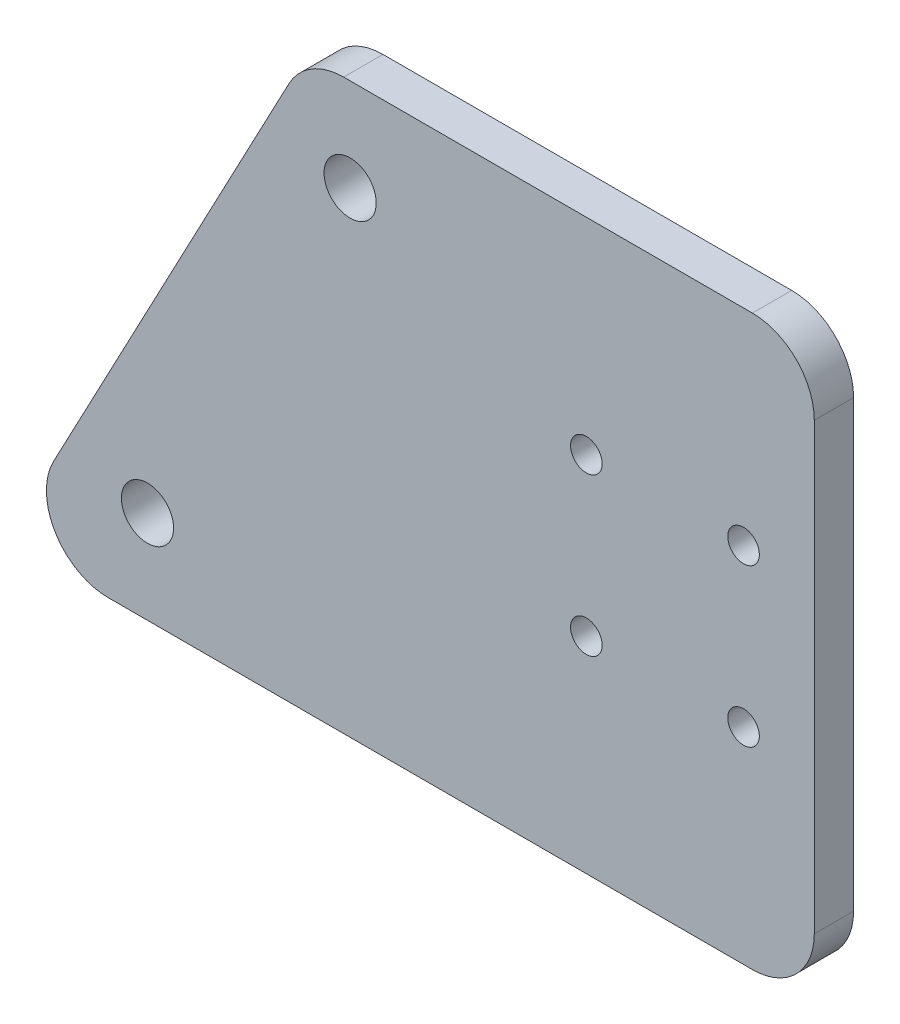
ISO-10303-21;
HEADER;
FILE_DESCRIPTION(('STEP AP214'),'2;1');
FILE_NAME('part.step','',(''),(''),'','','');
FILE_SCHEMA(('AUTOMOTIVE_DESIGN { 1 0 10303 214 1 1 1 1 }'));
ENDSEC;
DATA;
#1=APPLICATION_CONTEXT('core data for automotive mechanical design processes');
#2=APPLICATION_PROTOCOL_DEFINITION('international standard','automotive_design',2000,#1);
#3=PRODUCT_CONTEXT('',#1,'mechanical');
#4=PRODUCT('Part','Part','',(#3));
#5=PRODUCT_RELATED_PRODUCT_CATEGORY('part','',(#4));
#6=PRODUCT_DEFINITION_FORMATION('','',#4);
#7=PRODUCT_DEFINITION_CONTEXT('part definition',#1,'design');
#8=PRODUCT_DEFINITION('design','',#6,#7);
#9=PRODUCT_DEFINITION_SHAPE('','',#8);
#10=(LENGTH_UNIT() NAMED_UNIT(*) SI_UNIT(.MILLI.,.METRE.));
#11=(NAMED_UNIT(*) PLANE_ANGLE_UNIT() SI_UNIT($,.RADIAN.));
#12=(NAMED_UNIT(*) SI_UNIT($,.STERADIAN.) SOLID_ANGLE_UNIT());
#13=UNCERTAINTY_MEASURE_WITH_UNIT(LENGTH_MEASURE(1.E-05),#10,'distance_accuracy_value','');
#14=(GEOMETRIC_REPRESENTATION_CONTEXT(3) GLOBAL_UNCERTAINTY_ASSIGNED_CONTEXT((#13)) GLOBAL_UNIT_ASSIGNED_CONTEXT((#10,
#11,#12)) REPRESENTATION_CONTEXT('',''));
#15=CARTESIAN_POINT('',(0.,0.,0.));
#16=DIRECTION('',(0.,0.,1.));
#17=DIRECTION('',(1.,0.,0.));
#18=AXIS2_PLACEMENT_3D('',#15,#16,#17);
#19=CARTESIAN_POINT('',(0.,0.,6.35));
#20=DIRECTION('',(0.,0.,-1.));
#21=DIRECTION('',(-1.,0.,0.));
#22=AXIS2_PLACEMENT_3D('',#19,#20,#21);
#23=PLANE('',#22);
#24=CARTESIAN_POINT('',(338.57,-193.634865079161,6.35));
#25=DIRECTION('',(0.,0.,1.));
#26=DIRECTION('',(1.,0.,0.));
#27=AXIS2_PLACEMENT_3D('',#24,#25,#26);
#28=CIRCLE('',#27,2.55270000000004);
#29=CARTESIAN_POINT('',(341.1227,-193.634865079161,6.35));
#30=VERTEX_POINT('',#29);
#31=EDGE_CURVE('E392',#30,#30,#28,.T.);
#32=ORIENTED_EDGE('',*,*,#31,.F.);
#33=EDGE_LOOP('',(#32));
#34=FACE_BOUND('',#33,.T.);
#35=CARTESIAN_POINT('',(313.17,-193.634865079161,6.35));
#36=DIRECTION('',(0.,0.,1.));
#37=DIRECTION('',(1.,0.,0.));
#38=AXIS2_PLACEMENT_3D('',#35,#36,#37);
#39=CIRCLE('',#38,2.55270000000004);
#40=CARTESIAN_POINT('',(315.7227,-193.634865079161,6.35));
#41=VERTEX_POINT('',#40);
#42=EDGE_CURVE('E383',#41,#41,#39,.T.);
#43=ORIENTED_EDGE('',*,*,#42,.F.);
#44=EDGE_LOOP('',(#43));
#45=FACE_BOUND('',#44,.T.);
#46=CARTESIAN_POINT('',(313.17,-168.234865079161,6.35));
#47=DIRECTION('',(0.,0.,1.));
#48=DIRECTION('',(1.,0.,0.));
#49=AXIS2_PLACEMENT_3D('',#46,#47,#48);
#50=CIRCLE('',#49,2.55270000000004);
#51=CARTESIAN_POINT('',(315.7227,-168.234865079161,6.35));
#52=VERTEX_POINT('',#51);
#53=EDGE_CURVE('E378',#52,#52,#50,.T.);
#54=ORIENTED_EDGE('',*,*,#53,.F.);
#55=EDGE_LOOP('',(#54));
#56=FACE_BOUND('',#55,.T.);
#57=CARTESIAN_POINT('',(338.57,-168.234865079161,6.35));
#58=DIRECTION('',(0.,0.,1.));
#59=DIRECTION('',(1.,0.,0.));
#60=AXIS2_PLACEMENT_3D('',#57,#58,#59);
#61=CIRCLE('',#60,2.55270000000004);
#62=CARTESIAN_POINT('',(341.1227,-168.234865079161,6.35));
#63=VERTEX_POINT('',#62);
#64=EDGE_CURVE('E200',#63,#63,#61,.T.);
#65=ORIENTED_EDGE('',*,*,#64,.F.);
#66=EDGE_LOOP('',(#65));
#67=FACE_BOUND('',#66,.T.);
#68=DIRECTION('',(-1.,0.,0.));
#69=VECTOR('',#68,1.);
#70=CARTESIAN_POINT('',(267.938493178217,-135.,6.35));
#71=LINE('',#70,#69);
#72=CARTESIAN_POINT('',(340.,-135.,6.35));
#73=VERTEX_POINT('',#72);
#74=CARTESIAN_POINT('',(273.960259317813,-135.,6.35));
#75=VERTEX_POINT('',#74);
#76=EDGE_CURVE('E139',#73,#75,#71,.T.);
#77=ORIENTED_EDGE('',*,*,#76,.T.);
#78=CARTESIAN_POINT('',(273.960259317813,-145.,6.35));
#79=DIRECTION('',(0.,0.,-1.));
#80=DIRECTION('',(-1.,0.,0.));
#81=AXIS2_PLACEMENT_3D('',#78,#79,#80);
#82=CIRCLE('',#81,10.);
#83=CARTESIAN_POINT('',(265.121726438053,-140.322357801905,6.35));
#84=VERTEX_POINT('',#83);
#85=EDGE_CURVE('E154',#75,#84,#82,.F.);
#86=ORIENTED_EDGE('',*,*,#85,.T.);
#87=DIRECTION('',(-0.46776421980946,-0.883853287976034,0.));
#88=VECTOR('',#87,1.);
#89=CARTESIAN_POINT('',(267.938493178217,-135.,6.35));
#90=LINE('',#89,#88);
#91=CARTESIAN_POINT('',(227.085902265913,-212.192087960228,6.35));
#92=VERTEX_POINT('',#91);
#93=EDGE_CURVE('E121',#84,#92,#90,.T.);
#94=ORIENTED_EDGE('',*,*,#93,.T.);
#95=CARTESIAN_POINT('',(235.924435145673,-216.869730158322,6.35));
#96=DIRECTION('',(0.,0.,-1.));
#97=DIRECTION('',(-1.,0.,0.));
#98=AXIS2_PLACEMENT_3D('',#95,#96,#97);
#99=CIRCLE('',#98,10.);
#100=CARTESIAN_POINT('',(235.924435145673,-226.869730158322,6.35));
#101=VERTEX_POINT('',#100);
#102=EDGE_CURVE('E152',#92,#101,#99,.F.);
#103=ORIENTED_EDGE('',*,*,#102,.T.);
#104=DIRECTION('',(1.,0.,0.));
#105=VECTOR('',#104,1.);
#106=CARTESIAN_POINT('',(350.,-226.869730158322,6.35));
#107=LINE('',#106,#105);
#108=CARTESIAN_POINT('',(340.,-226.869730158322,6.35));
#109=VERTEX_POINT('',#108);
#110=EDGE_CURVE('E165',#101,#109,#107,.T.);
#111=ORIENTED_EDGE('',*,*,#110,.T.);
#112=CARTESIAN_POINT('',(340.,-216.869730158322,6.35));
#113=DIRECTION('',(0.,0.,-1.));
#114=DIRECTION('',(-1.,0.,0.));
#115=AXIS2_PLACEMENT_3D('',#112,#113,#114);
#116=CIRCLE('',#115,10.);
#117=CARTESIAN_POINT('',(350.,-216.869730158322,6.35));
#118=VERTEX_POINT('',#117);
#119=EDGE_CURVE('E56',#109,#118,#116,.F.);
#120=ORIENTED_EDGE('',*,*,#119,.T.);
#121=DIRECTION('',(0.,1.,0.));
#122=VECTOR('',#121,1.);
#123=CARTESIAN_POINT('',(350.,-135.,6.35));
#124=LINE('',#123,#122);
#125=CARTESIAN_POINT('',(350.,-145.,6.35));
#126=VERTEX_POINT('',#125);
#127=EDGE_CURVE('E140',#118,#126,#124,.T.);
#128=ORIENTED_EDGE('',*,*,#127,.T.);
#129=CARTESIAN_POINT('',(340.,-145.,6.35));
#130=DIRECTION('',(0.,0.,-1.));
#131=DIRECTION('',(-1.,0.,0.));
#132=AXIS2_PLACEMENT_3D('',#129,#130,#131);
#133=CIRCLE('',#132,10.);
#134=EDGE_CURVE('E149',#126,#73,#133,.F.);
#135=ORIENTED_EDGE('',*,*,#134,.T.);
#136=EDGE_LOOP('',(#77,#86,#94,#103,#111,#120,#128,#135));
#137=FACE_BOUND('',#136,.T.);
#138=CARTESIAN_POINT('',(275.,-150.,6.35));
#139=DIRECTION('',(0.,0.,1.));
#140=DIRECTION('',(1.,0.,0.));
#141=AXIS2_PLACEMENT_3D('',#138,#139,#140);
#142=CIRCLE('',#141,4.21640000000003);
#143=CARTESIAN_POINT('',(279.2164,-150.,6.35));
#144=VERTEX_POINT('',#143);
#145=EDGE_CURVE('E134',#144,#144,#142,.T.);
#146=ORIENTED_EDGE('',*,*,#145,.F.);
#147=EDGE_LOOP('',(#146));
#148=FACE_BOUND('',#147,.T.);
#149=CARTESIAN_POINT('',(242.256504613338,-211.869730158322,6.35));
#150=DIRECTION('',(0.,0.,1.));
#151=DIRECTION('',(1.,0.,0.));
#152=AXIS2_PLACEMENT_3D('',#149,#150,#151);
#153=CIRCLE('',#152,4.21640000000001);
#154=CARTESIAN_POINT('',(246.472904613338,-211.869730158322,6.35));
#155=VERTEX_POINT('',#154);
#156=EDGE_CURVE('E190',#155,#155,#153,.T.);
#157=ORIENTED_EDGE('',*,*,#156,.F.);
#158=EDGE_LOOP('',(#157));
#159=FACE_BOUND('',#158,.T.);
#160=ADVANCED_FACE('F35',(#34,#45,#56,#67,#137,#148,#159),#23,.F.);
#161=CARTESIAN_POINT('',(0.,0.,0.));
#162=DIRECTION('',(0.,0.,-1.));
#163=DIRECTION('',(-1.,0.,0.));
#164=AXIS2_PLACEMENT_3D('',#161,#162,#163);
#165=PLANE('',#164);
#166=CARTESIAN_POINT('',(338.57,-193.634865079161,0.));
#167=DIRECTION('',(0.,0.,1.));
#168=DIRECTION('',(1.,0.,0.));
#169=AXIS2_PLACEMENT_3D('',#166,#167,#168);
#170=CIRCLE('',#169,2.55270000000004);
#171=CARTESIAN_POINT('',(341.1227,-193.634865079161,0.));
#172=VERTEX_POINT('',#171);
#173=EDGE_CURVE('E390',#172,#172,#170,.T.);
#174=ORIENTED_EDGE('',*,*,#173,.T.);
#175=EDGE_LOOP('',(#174));
#176=FACE_BOUND('',#175,.T.);
#177=CARTESIAN_POINT('',(313.17,-193.634865079161,0.));
#178=DIRECTION('',(0.,0.,1.));
#179=DIRECTION('',(1.,0.,0.));
#180=AXIS2_PLACEMENT_3D('',#177,#178,#179);
#181=CIRCLE('',#180,2.55270000000004);
#182=CARTESIAN_POINT('',(315.7227,-193.634865079161,0.));
#183=VERTEX_POINT('',#182);
#184=EDGE_CURVE('E380',#183,#183,#181,.T.);
#185=ORIENTED_EDGE('',*,*,#184,.T.);
#186=EDGE_LOOP('',(#185));
#187=FACE_BOUND('',#186,.T.);
#188=CARTESIAN_POINT('',(313.17,-168.234865079161,0.));
#189=DIRECTION('',(0.,0.,1.));
#190=DIRECTION('',(1.,0.,0.));
#191=AXIS2_PLACEMENT_3D('',#188,#189,#190);
#192=CIRCLE('',#191,2.55270000000004);
#193=CARTESIAN_POINT('',(315.7227,-168.234865079161,0.));
#194=VERTEX_POINT('',#193);
#195=EDGE_CURVE('E205',#194,#194,#192,.T.);
#196=ORIENTED_EDGE('',*,*,#195,.T.);
#197=EDGE_LOOP('',(#196));
#198=FACE_BOUND('',#197,.T.);
#199=CARTESIAN_POINT('',(338.57,-168.234865079161,0.));
#200=DIRECTION('',(0.,0.,1.));
#201=DIRECTION('',(1.,0.,0.));
#202=AXIS2_PLACEMENT_3D('',#199,#200,#201);
#203=CIRCLE('',#202,2.55270000000004);
#204=CARTESIAN_POINT('',(341.1227,-168.234865079161,0.));
#205=VERTEX_POINT('',#204);
#206=EDGE_CURVE('E204',#205,#205,#203,.T.);
#207=ORIENTED_EDGE('',*,*,#206,.T.);
#208=EDGE_LOOP('',(#207));
#209=FACE_BOUND('',#208,.T.);
#210=CARTESIAN_POINT('',(275.,-150.,0.));
#211=DIRECTION('',(0.,0.,1.));
#212=DIRECTION('',(1.,0.,0.));
#213=AXIS2_PLACEMENT_3D('',#210,#211,#212);
#214=CIRCLE('',#213,4.21640000000003);
#215=CARTESIAN_POINT('',(279.2164,-150.,0.));
#216=VERTEX_POINT('',#215);
#217=EDGE_CURVE('E186',#216,#216,#214,.T.);
#218=ORIENTED_EDGE('',*,*,#217,.T.);
#219=EDGE_LOOP('',(#218));
#220=FACE_BOUND('',#219,.T.);
#221=DIRECTION('',(-0.46776421980946,-0.883853287976034,0.));
#222=VECTOR('',#221,1.);
#223=CARTESIAN_POINT('',(267.938493178217,-135.,0.));
#224=LINE('',#223,#222);
#225=CARTESIAN_POINT('',(265.121726438053,-140.322357801905,0.));
#226=VERTEX_POINT('',#225);
#227=CARTESIAN_POINT('',(227.085902265913,-212.192087960228,0.));
#228=VERTEX_POINT('',#227);
#229=EDGE_CURVE('E118',#226,#228,#224,.T.);
#230=ORIENTED_EDGE('',*,*,#229,.F.);
#231=CARTESIAN_POINT('',(273.960259317813,-145.,0.));
#232=DIRECTION('',(0.,0.,-1.));
#233=DIRECTION('',(-1.,0.,0.));
#234=AXIS2_PLACEMENT_3D('',#231,#232,#233);
#235=CIRCLE('',#234,10.);
#236=CARTESIAN_POINT('',(273.960259317813,-135.,0.));
#237=VERTEX_POINT('',#236);
#238=EDGE_CURVE('E101',#226,#237,#235,.T.);
#239=ORIENTED_EDGE('',*,*,#238,.T.);
#240=DIRECTION('',(-1.,0.,0.));
#241=VECTOR('',#240,1.);
#242=CARTESIAN_POINT('',(267.938493178217,-135.,0.));
#243=LINE('',#242,#241);
#244=CARTESIAN_POINT('',(340.,-135.,0.));
#245=VERTEX_POINT('',#244);
#246=EDGE_CURVE('E129',#245,#237,#243,.T.);
#247=ORIENTED_EDGE('',*,*,#246,.F.);
#248=CARTESIAN_POINT('',(340.,-145.,0.));
#249=DIRECTION('',(0.,0.,-1.));
#250=DIRECTION('',(-1.,0.,0.));
#251=AXIS2_PLACEMENT_3D('',#248,#249,#250);
#252=CIRCLE('',#251,10.);
#253=CARTESIAN_POINT('',(350.,-145.,0.));
#254=VERTEX_POINT('',#253);
#255=EDGE_CURVE('E122',#245,#254,#252,.T.);
#256=ORIENTED_EDGE('',*,*,#255,.T.);
#257=DIRECTION('',(0.,1.,0.));
#258=VECTOR('',#257,1.);
#259=CARTESIAN_POINT('',(350.,-135.,0.));
#260=LINE('',#259,#258);
#261=CARTESIAN_POINT('',(350.,-216.869730158322,0.));
#262=VERTEX_POINT('',#261);
#263=EDGE_CURVE('E132',#262,#254,#260,.T.);
#264=ORIENTED_EDGE('',*,*,#263,.F.);
#265=CARTESIAN_POINT('',(340.,-216.869730158322,0.));
#266=DIRECTION('',(0.,0.,-1.));
#267=DIRECTION('',(-1.,0.,0.));
#268=AXIS2_PLACEMENT_3D('',#265,#266,#267);
#269=CIRCLE('',#268,10.);
#270=CARTESIAN_POINT('',(340.,-226.869730158322,0.));
#271=VERTEX_POINT('',#270);
#272=EDGE_CURVE('E143',#262,#271,#269,.T.);
#273=ORIENTED_EDGE('',*,*,#272,.T.);
#274=DIRECTION('',(1.,0.,0.));
#275=VECTOR('',#274,1.);
#276=CARTESIAN_POINT('',(350.,-226.869730158322,0.));
#277=LINE('',#276,#275);
#278=CARTESIAN_POINT('',(235.924435145673,-226.869730158322,0.));
#279=VERTEX_POINT('',#278);
#280=EDGE_CURVE('E128',#279,#271,#277,.T.);
#281=ORIENTED_EDGE('',*,*,#280,.F.);
#282=CARTESIAN_POINT('',(235.924435145673,-216.869730158322,0.));
#283=DIRECTION('',(0.,0.,-1.));
#284=DIRECTION('',(-1.,0.,0.));
#285=AXIS2_PLACEMENT_3D('',#282,#283,#284);
#286=CIRCLE('',#285,10.);
#287=EDGE_CURVE('E112',#279,#228,#286,.T.);
#288=ORIENTED_EDGE('',*,*,#287,.T.);
#289=EDGE_LOOP('',(#230,#239,#247,#256,#264,#273,#281,#288));
#290=FACE_BOUND('',#289,.T.);
#291=CARTESIAN_POINT('',(242.256504613338,-211.869730158322,0.));
#292=DIRECTION('',(0.,0.,1.));
#293=DIRECTION('',(1.,0.,0.));
#294=AXIS2_PLACEMENT_3D('',#291,#292,#293);
#295=CIRCLE('',#294,4.21640000000001);
#296=CARTESIAN_POINT('',(246.472904613338,-211.869730158322,0.));
#297=VERTEX_POINT('',#296);
#298=EDGE_CURVE('E187',#297,#297,#295,.T.);
#299=ORIENTED_EDGE('',*,*,#298,.T.);
#300=EDGE_LOOP('',(#299));
#301=FACE_BOUND('',#300,.T.);
#302=ADVANCED_FACE('F125',(#176,#187,#198,#209,#220,#290,#301),#165,.T.);
#303=CARTESIAN_POINT('',(267.938493178217,-135.,6.35));
#304=DIRECTION('',(0.,-1.,0.));
#305=DIRECTION('',(0.,0.,-1.));
#306=AXIS2_PLACEMENT_3D('',#303,#304,#305);
#307=PLANE('',#306);
#308=ORIENTED_EDGE('',*,*,#246,.T.);
#309=DIRECTION('',(0.,0.,-1.));
#310=VECTOR('',#309,1.);
#311=CARTESIAN_POINT('',(273.960259317813,-135.,6.35));
#312=LINE('',#311,#310);
#313=EDGE_CURVE('E106',#237,#75,#312,.F.);
#314=ORIENTED_EDGE('',*,*,#313,.T.);
#315=ORIENTED_EDGE('',*,*,#76,.F.);
#316=DIRECTION('',(0.,0.,-1.));
#317=VECTOR('',#316,1.);
#318=CARTESIAN_POINT('',(340.,-135.,6.35));
#319=LINE('',#318,#317);
#320=EDGE_CURVE('E111',#73,#245,#319,.T.);
#321=ORIENTED_EDGE('',*,*,#320,.T.);
#322=EDGE_LOOP('',(#308,#314,#315,#321));
#323=FACE_BOUND('',#322,.T.);
#324=ADVANCED_FACE('F240',(#323),#307,.F.);
#325=CARTESIAN_POINT('',(267.938493178217,-135.,6.35));
#326=DIRECTION('',(0.883853287976034,-0.46776421980946,0.));
#327=DIRECTION('',(0.46776421980946,0.883853287976034,0.));
#328=AXIS2_PLACEMENT_3D('',#325,#326,#327);
#329=PLANE('',#328);
#330=ORIENTED_EDGE('',*,*,#93,.F.);
#331=DIRECTION('',(0.,0.,-1.));
#332=VECTOR('',#331,1.);
#333=CARTESIAN_POINT('',(265.121726438053,-140.322357801905,6.35));
#334=LINE('',#333,#332);
#335=EDGE_CURVE('E105',#84,#226,#334,.T.);
#336=ORIENTED_EDGE('',*,*,#335,.T.);
#337=ORIENTED_EDGE('',*,*,#229,.T.);
#338=DIRECTION('',(0.,0.,-1.));
#339=VECTOR('',#338,1.);
#340=CARTESIAN_POINT('',(227.085902265913,-212.192087960228,6.35));
#341=LINE('',#340,#339);
#342=EDGE_CURVE('E123',#228,#92,#341,.F.);
#343=ORIENTED_EDGE('',*,*,#342,.T.);
#344=EDGE_LOOP('',(#330,#336,#337,#343));
#345=FACE_BOUND('',#344,.T.);
#346=ADVANCED_FACE('F117',(#345),#329,.F.);
#347=CARTESIAN_POINT('',(350.,-226.869730158322,6.35));
#348=DIRECTION('',(0.,1.,0.));
#349=DIRECTION('',(0.,0.,1.));
#350=AXIS2_PLACEMENT_3D('',#347,#348,#349);
#351=PLANE('',#350);
#352=ORIENTED_EDGE('',*,*,#110,.F.);
#353=DIRECTION('',(0.,0.,-1.));
#354=VECTOR('',#353,1.);
#355=CARTESIAN_POINT('',(235.924435145673,-226.869730158322,6.35));
#356=LINE('',#355,#354);
#357=EDGE_CURVE('E158',#101,#279,#356,.T.);
#358=ORIENTED_EDGE('',*,*,#357,.T.);
#359=ORIENTED_EDGE('',*,*,#280,.T.);
#360=DIRECTION('',(0.,0.,-1.));
#361=VECTOR('',#360,1.);
#362=CARTESIAN_POINT('',(340.,-226.869730158322,6.35));
#363=LINE('',#362,#361);
#364=EDGE_CURVE('E156',#271,#109,#363,.F.);
#365=ORIENTED_EDGE('',*,*,#364,.T.);
#366=EDGE_LOOP('',(#352,#358,#359,#365));
#367=FACE_BOUND('',#366,.T.);
#368=ADVANCED_FACE('F163',(#367),#351,.F.);
#369=CARTESIAN_POINT('',(350.,-135.,6.35));
#370=DIRECTION('',(-1.,0.,0.));
#371=DIRECTION('',(0.,0.,1.));
#372=AXIS2_PLACEMENT_3D('',#369,#370,#371);
#373=PLANE('',#372);
#374=ORIENTED_EDGE('',*,*,#127,.F.);
#375=DIRECTION('',(0.,0.,-1.));
#376=VECTOR('',#375,1.);
#377=CARTESIAN_POINT('',(350.,-216.869730158322,6.35));
#378=LINE('',#377,#376);
#379=EDGE_CURVE('E12',#118,#262,#378,.T.);
#380=ORIENTED_EDGE('',*,*,#379,.T.);
#381=ORIENTED_EDGE('',*,*,#263,.T.);
#382=DIRECTION('',(0.,0.,-1.));
#383=VECTOR('',#382,1.);
#384=CARTESIAN_POINT('',(350.,-145.,6.35));
#385=LINE('',#384,#383);
#386=EDGE_CURVE('E43',#254,#126,#385,.F.);
#387=ORIENTED_EDGE('',*,*,#386,.T.);
#388=EDGE_LOOP('',(#374,#380,#381,#387));
#389=FACE_BOUND('',#388,.T.);
#390=ADVANCED_FACE('F172',(#389),#373,.F.);
#391=CARTESIAN_POINT('',(275.,-150.,6.35));
#392=DIRECTION('',(0.,0.,-1.));
#393=DIRECTION('',(-1.,0.,0.));
#394=AXIS2_PLACEMENT_3D('',#391,#392,#393);
#395=CYLINDRICAL_SURFACE('',#394,4.21640000000003);
#396=ORIENTED_EDGE('',*,*,#145,.T.);
#397=EDGE_LOOP('',(#396));
#398=FACE_BOUND('',#397,.T.);
#399=ORIENTED_EDGE('',*,*,#217,.F.);
#400=EDGE_LOOP('',(#399));
#401=FACE_BOUND('',#400,.T.);
#402=ADVANCED_FACE('F234',(#398,#401),#395,.F.);
#403=CARTESIAN_POINT('',(242.256504613338,-211.869730158322,6.35));
#404=DIRECTION('',(0.,0.,-1.));
#405=DIRECTION('',(-1.,0.,0.));
#406=AXIS2_PLACEMENT_3D('',#403,#404,#405);
#407=CYLINDRICAL_SURFACE('',#406,4.21640000000001);
#408=ORIENTED_EDGE('',*,*,#156,.T.);
#409=EDGE_LOOP('',(#408));
#410=FACE_BOUND('',#409,.T.);
#411=ORIENTED_EDGE('',*,*,#298,.F.);
#412=EDGE_LOOP('',(#411));
#413=FACE_BOUND('',#412,.T.);
#414=ADVANCED_FACE('F222',(#410,#413),#407,.F.);
#415=CARTESIAN_POINT('',(338.57,-168.234865079161,0.));
#416=DIRECTION('',(0.,0.,1.));
#417=DIRECTION('',(1.,0.,0.));
#418=AXIS2_PLACEMENT_3D('',#415,#416,#417);
#419=CYLINDRICAL_SURFACE('',#418,2.55270000000004);
#420=ORIENTED_EDGE('',*,*,#206,.F.);
#421=EDGE_LOOP('',(#420));
#422=FACE_BOUND('',#421,.T.);
#423=ORIENTED_EDGE('',*,*,#64,.T.);
#424=EDGE_LOOP('',(#423));
#425=FACE_BOUND('',#424,.T.);
#426=ADVANCED_FACE('F218',(#422,#425),#419,.F.);
#427=CARTESIAN_POINT('',(313.17,-168.234865079161,0.));
#428=DIRECTION('',(0.,0.,1.));
#429=DIRECTION('',(1.,0.,0.));
#430=AXIS2_PLACEMENT_3D('',#427,#428,#429);
#431=CYLINDRICAL_SURFACE('',#430,2.55270000000004);
#432=ORIENTED_EDGE('',*,*,#195,.F.);
#433=EDGE_LOOP('',(#432));
#434=FACE_BOUND('',#433,.T.);
#435=ORIENTED_EDGE('',*,*,#53,.T.);
#436=EDGE_LOOP('',(#435));
#437=FACE_BOUND('',#436,.T.);
#438=ADVANCED_FACE('F221',(#434,#437),#431,.F.);
#439=CARTESIAN_POINT('',(313.17,-193.634865079161,0.));
#440=DIRECTION('',(0.,0.,1.));
#441=DIRECTION('',(1.,0.,0.));
#442=AXIS2_PLACEMENT_3D('',#439,#440,#441);
#443=CYLINDRICAL_SURFACE('',#442,2.55270000000004);
#444=ORIENTED_EDGE('',*,*,#184,.F.);
#445=EDGE_LOOP('',(#444));
#446=FACE_BOUND('',#445,.T.);
#447=ORIENTED_EDGE('',*,*,#42,.T.);
#448=EDGE_LOOP('',(#447));
#449=FACE_BOUND('',#448,.T.);
#450=ADVANCED_FACE('F330',(#446,#449),#443,.F.);
#451=CARTESIAN_POINT('',(338.57,-193.634865079161,0.));
#452=DIRECTION('',(0.,0.,1.));
#453=DIRECTION('',(1.,0.,0.));
#454=AXIS2_PLACEMENT_3D('',#451,#452,#453);
#455=CYLINDRICAL_SURFACE('',#454,2.55270000000004);
#456=ORIENTED_EDGE('',*,*,#173,.F.);
#457=EDGE_LOOP('',(#456));
#458=FACE_BOUND('',#457,.T.);
#459=ORIENTED_EDGE('',*,*,#31,.T.);
#460=EDGE_LOOP('',(#459));
#461=FACE_BOUND('',#460,.T.);
#462=ADVANCED_FACE('F260',(#458,#461),#455,.F.);
#463=CARTESIAN_POINT('',(273.960259317813,-145.,6.35));
#464=DIRECTION('',(0.,0.,-1.));
#465=DIRECTION('',(-1.,0.,0.));
#466=AXIS2_PLACEMENT_3D('',#463,#464,#465);
#467=CYLINDRICAL_SURFACE('',#466,10.);
#468=ORIENTED_EDGE('',*,*,#85,.F.);
#469=ORIENTED_EDGE('',*,*,#313,.F.);
#470=ORIENTED_EDGE('',*,*,#238,.F.);
#471=ORIENTED_EDGE('',*,*,#335,.F.);
#472=EDGE_LOOP('',(#468,#469,#470,#471));
#473=FACE_BOUND('',#472,.T.);
#474=ADVANCED_FACE('F104',(#473),#467,.T.);
#475=CARTESIAN_POINT('',(235.924435145673,-216.869730158322,6.35));
#476=DIRECTION('',(0.,0.,-1.));
#477=DIRECTION('',(-1.,0.,0.));
#478=AXIS2_PLACEMENT_3D('',#475,#476,#477);
#479=CYLINDRICAL_SURFACE('',#478,10.);
#480=ORIENTED_EDGE('',*,*,#102,.F.);
#481=ORIENTED_EDGE('',*,*,#342,.F.);
#482=ORIENTED_EDGE('',*,*,#287,.F.);
#483=ORIENTED_EDGE('',*,*,#357,.F.);
#484=EDGE_LOOP('',(#480,#481,#482,#483));
#485=FACE_BOUND('',#484,.T.);
#486=ADVANCED_FACE('F259',(#485),#479,.T.);
#487=CARTESIAN_POINT('',(340.,-216.869730158322,6.35));
#488=DIRECTION('',(0.,0.,-1.));
#489=DIRECTION('',(-1.,0.,0.));
#490=AXIS2_PLACEMENT_3D('',#487,#488,#489);
#491=CYLINDRICAL_SURFACE('',#490,10.);
#492=ORIENTED_EDGE('',*,*,#119,.F.);
#493=ORIENTED_EDGE('',*,*,#364,.F.);
#494=ORIENTED_EDGE('',*,*,#272,.F.);
#495=ORIENTED_EDGE('',*,*,#379,.F.);
#496=EDGE_LOOP('',(#492,#493,#494,#495));
#497=FACE_BOUND('',#496,.T.);
#498=ADVANCED_FACE('F171',(#497),#491,.T.);
#499=CARTESIAN_POINT('',(340.,-145.,6.35));
#500=DIRECTION('',(0.,0.,-1.));
#501=DIRECTION('',(-1.,0.,0.));
#502=AXIS2_PLACEMENT_3D('',#499,#500,#501);
#503=CYLINDRICAL_SURFACE('',#502,10.);
#504=ORIENTED_EDGE('',*,*,#134,.F.);
#505=ORIENTED_EDGE('',*,*,#386,.F.);
#506=ORIENTED_EDGE('',*,*,#255,.F.);
#507=ORIENTED_EDGE('',*,*,#320,.F.);
#508=EDGE_LOOP('',(#504,#505,#506,#507));
#509=FACE_BOUND('',#508,.T.);
#510=ADVANCED_FACE('F37',(#509),#503,.T.);
#511=CLOSED_SHELL('',(#160,#302,#324,#346,#368,#390,#402,#414,#426,#438,#450,#462,#474,#486,
#498,#510));
#512=MANIFOLD_SOLID_BREP('B2',#511);
#513=ADVANCED_BREP_SHAPE_REPRESENTATION('',(#18,#512),#14);
#514=SHAPE_DEFINITION_REPRESENTATION(#9,#513);
ENDSEC;
END-ISO-10303-21;
